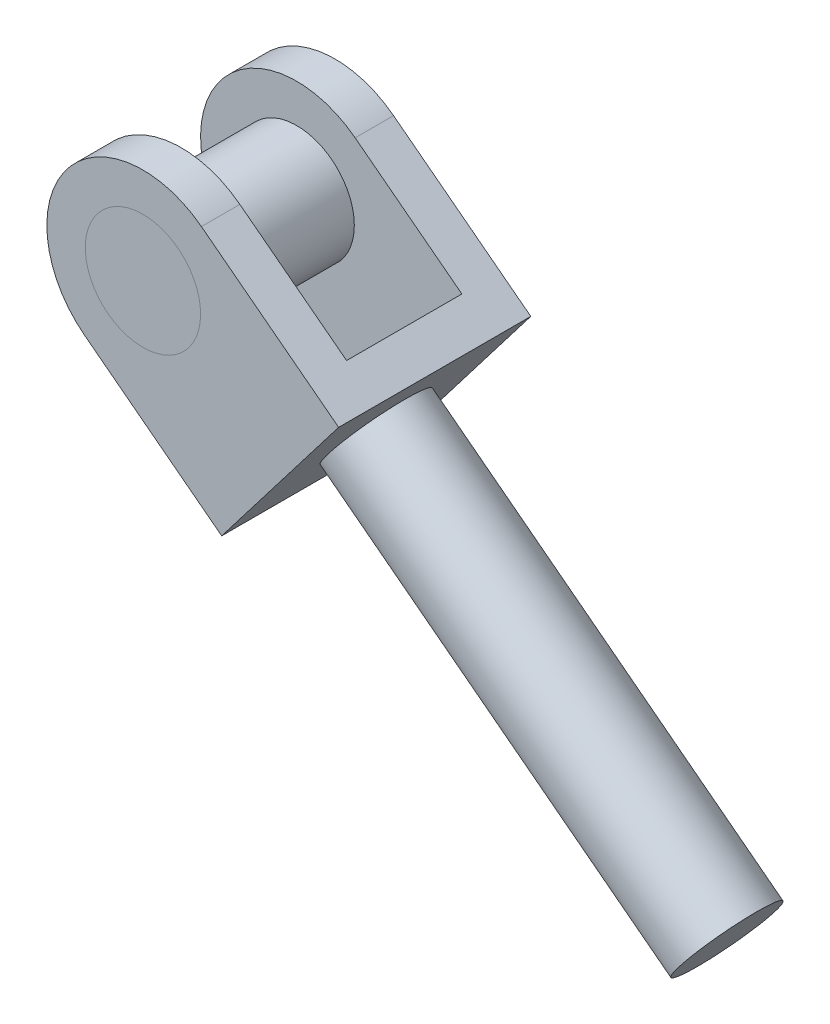
ISO-10303-21;
HEADER;
FILE_DESCRIPTION(('STEP AP214'),'2;1');
FILE_NAME('part.step','',(''),(''),'','','');
FILE_SCHEMA(('AUTOMOTIVE_DESIGN { 1 0 10303 214 1 1 1 1 }'));
ENDSEC;
DATA;
#1=APPLICATION_CONTEXT('core data for automotive mechanical design processes');
#2=APPLICATION_PROTOCOL_DEFINITION('international standard','automotive_design',2000,#1);
#3=PRODUCT_CONTEXT('',#1,'mechanical');
#4=PRODUCT('Part','Part','',(#3));
#5=PRODUCT_RELATED_PRODUCT_CATEGORY('part','',(#4));
#6=PRODUCT_DEFINITION_FORMATION('','',#4);
#7=PRODUCT_DEFINITION_CONTEXT('part definition',#1,'design');
#8=PRODUCT_DEFINITION('design','',#6,#7);
#9=PRODUCT_DEFINITION_SHAPE('','',#8);
#10=(LENGTH_UNIT() NAMED_UNIT(*) SI_UNIT(.MILLI.,.METRE.));
#11=(NAMED_UNIT(*) PLANE_ANGLE_UNIT() SI_UNIT($,.RADIAN.));
#12=(NAMED_UNIT(*) SI_UNIT($,.STERADIAN.) SOLID_ANGLE_UNIT());
#13=UNCERTAINTY_MEASURE_WITH_UNIT(LENGTH_MEASURE(1.E-05),#10,'distance_accuracy_value','');
#14=(GEOMETRIC_REPRESENTATION_CONTEXT(3) GLOBAL_UNCERTAINTY_ASSIGNED_CONTEXT((#13)) GLOBAL_UNIT_ASSIGNED_CONTEXT((#10,
#11,#12)) REPRESENTATION_CONTEXT('',''));
#15=CARTESIAN_POINT('',(0.,0.,0.));
#16=DIRECTION('',(0.,0.,1.));
#17=DIRECTION('',(1.,0.,0.));
#18=AXIS2_PLACEMENT_3D('',#15,#16,#17);
#19=CARTESIAN_POINT('',(-30.,45.,-13.4852813742386));
#20=DIRECTION('',(0.,0.,1.));
#21=DIRECTION('',(1.,0.,0.));
#22=AXIS2_PLACEMENT_3D('',#19,#20,#21);
#23=CYLINDRICAL_SURFACE('',#22,3.);
#24=CARTESIAN_POINT('',(-30.,45.,-5.));
#25=DIRECTION('',(0.,0.,1.));
#26=DIRECTION('',(0.,-1.,0.));
#27=AXIS2_PLACEMENT_3D('',#24,#25,#26);
#28=CIRCLE('',#27,3.);
#29=CARTESIAN_POINT('',(-30.,42.,-5.));
#30=VERTEX_POINT('',#29);
#31=EDGE_CURVE('P0_E10',#30,#30,#28,.F.);
#32=ORIENTED_EDGE('',*,*,#31,.F.);
#33=EDGE_LOOP('',(#32));
#34=FACE_BOUND('',#33,.T.);
#35=CARTESIAN_POINT('',(-30.,45.,5.));
#36=DIRECTION('',(0.,0.,1.));
#37=DIRECTION('',(1.,0.,0.));
#38=AXIS2_PLACEMENT_3D('',#35,#36,#37);
#39=CIRCLE('',#38,3.);
#40=CARTESIAN_POINT('',(-27.,45.,5.));
#41=VERTEX_POINT('',#40);
#42=EDGE_CURVE('P0_E21',#41,#41,#39,.T.);
#43=ORIENTED_EDGE('',*,*,#42,.F.);
#44=EDGE_LOOP('',(#43));
#45=FACE_BOUND('',#44,.T.);
#46=ADVANCED_FACE('P0_F15',(#34,#45),#23,.T.);
#47=CARTESIAN_POINT('',(-30.,45.,5.));
#48=DIRECTION('',(0.,0.,1.));
#49=DIRECTION('',(1.,0.,0.));
#50=AXIS2_PLACEMENT_3D('',#47,#48,#49);
#51=PLANE('',#50);
#52=ORIENTED_EDGE('',*,*,#42,.T.);
#53=EDGE_LOOP('',(#52));
#54=FACE_BOUND('',#53,.T.);
#55=ADVANCED_FACE('P0_F27',(#54),#51,.T.);
#56=CARTESIAN_POINT('',(-19.8156699022371,43.4902250300793,-5.));
#57=DIRECTION('',(0.,0.,1.));
#58=DIRECTION('',(0.,-1.,0.));
#59=AXIS2_PLACEMENT_3D('',#56,#57,#58);
#60=PLANE('',#59);
#61=ORIENTED_EDGE('',*,*,#31,.T.);
#62=EDGE_LOOP('',(#61));
#63=FACE_BOUND('',#62,.T.);
#64=ADVANCED_FACE('P0_F35',(#63),#60,.F.);
#65=CLOSED_SHELL('',(#46,#55,#64));
#66=MANIFOLD_SOLID_BREP('P0_B1',#65);
#67=CARTESIAN_POINT('',(-35.0651068984367,26.8937619978095,0.));
#68=DIRECTION('',(0.793491471983616,-0.608581369982088,0.));
#69=DIRECTION('',(0.608581369982088,0.793491471983616,0.));
#70=AXIS2_PLACEMENT_3D('',#67,#68,#69);
#71=PLANE('',#70);
#72=DIRECTION('',(0.608581369982088,0.793491471983616,0.));
#73=VECTOR('',#72,1.);
#74=CARTESIAN_POINT('',(-27.4884665460251,36.7724730502073,-3.));
#75=LINE('',#74,#73);
#76=CARTESIAN_POINT('',(-27.4884665460251,36.7724730502073,-3.));
#77=VERTEX_POINT('',#76);
#78=CARTESIAN_POINT('',(-21.4026528462043,44.7073877700434,-3.));
#79=VERTEX_POINT('',#78);
#80=EDGE_CURVE('P1_E126',#77,#79,#75,.T.);
#81=ORIENTED_EDGE('',*,*,#80,.F.);
#82=DIRECTION('',(0.,0.,-1.));
#83=VECTOR('',#82,1.);
#84=CARTESIAN_POINT('',(-27.4884665460251,36.7724730502073,5.));
#85=LINE('',#84,#83);
#86=CARTESIAN_POINT('',(-27.4884665460251,36.7724730502073,3.));
#87=VERTEX_POINT('',#86);
#88=EDGE_CURVE('P1_E98',#87,#77,#85,.T.);
#89=ORIENTED_EDGE('',*,*,#88,.F.);
#90=DIRECTION('',(0.608581369982088,0.793491471983616,0.));
#91=VECTOR('',#90,1.);
#92=CARTESIAN_POINT('',(-27.4884665460251,36.7724730502073,3.));
#93=LINE('',#92,#91);
#94=CARTESIAN_POINT('',(-21.4026528462043,44.7073877700434,3.));
#95=VERTEX_POINT('',#94);
#96=EDGE_CURVE('P1_E73',#87,#95,#93,.T.);
#97=ORIENTED_EDGE('',*,*,#96,.T.);
#98=DIRECTION('',(0.,0.,1.));
#99=VECTOR('',#98,1.);
#100=CARTESIAN_POINT('',(-21.4026528462043,44.7073877700435,5.));
#101=LINE('',#100,#99);
#102=EDGE_CURVE('P1_E95',#79,#95,#101,.T.);
#103=ORIENTED_EDGE('',*,*,#102,.F.);
#104=EDGE_LOOP('',(#81,#89,#97,#103));
#105=FACE_BOUND('',#104,.T.);
#106=ADVANCED_FACE('P1_F17',(#105),#71,.F.);
#107=CARTESIAN_POINT('',(-30.,45.,5.));
#108=DIRECTION('',(0.,0.,1.));
#109=DIRECTION('',(1.,0.,0.));
#110=AXIS2_PLACEMENT_3D('',#107,#108,#109);
#111=PLANE('',#110);
#112=DIRECTION('',(0.793491471983616,-0.608581369982088,0.));
#113=VECTOR('',#112,1.);
#114=CARTESIAN_POINT('',(-33.0429068499105,41.0325426400819,5.));
#115=LINE('',#114,#113);
#116=CARTESIAN_POINT('',(-33.0429068499105,41.0325426400819,5.));
#117=VERTEX_POINT('',#116);
#118=CARTESIAN_POINT('',(-25.9014836020579,35.5553103102431,5.));
#119=VERTEX_POINT('',#118);
#120=EDGE_CURVE('P1_E68',#117,#119,#115,.T.);
#121=ORIENTED_EDGE('',*,*,#120,.T.);
#122=DIRECTION('',(-0.608581369982088,-0.793491471983616,0.));
#123=VECTOR('',#122,1.);
#124=CARTESIAN_POINT('',(-19.8156699022371,43.4902250300793,5.));
#125=LINE('',#124,#123);
#126=CARTESIAN_POINT('',(-19.8156699022371,43.4902250300793,5.));
#127=VERTEX_POINT('',#126);
#128=EDGE_CURVE('P1_E97',#127,#119,#125,.T.);
#129=ORIENTED_EDGE('',*,*,#128,.F.);
#130=DIRECTION('',(-0.793491471983616,0.608581369982088,0.));
#131=VECTOR('',#130,1.);
#132=CARTESIAN_POINT('',(-21.4026528462043,44.7073877700434,5.));
#133=LINE('',#132,#131);
#134=CARTESIAN_POINT('',(-26.9570931500895,48.9674573599181,5.));
#135=VERTEX_POINT('',#134);
#136=EDGE_CURVE('P1_E74',#127,#135,#133,.T.);
#137=ORIENTED_EDGE('',*,*,#136,.T.);
#138=CARTESIAN_POINT('',(-30.,45.,5.));
#139=DIRECTION('',(0.,0.,1.));
#140=DIRECTION('',(1.,0.,0.));
#141=AXIS2_PLACEMENT_3D('',#138,#139,#140);
#142=CIRCLE('',#141,5.);
#143=EDGE_CURVE('P1_E35',#135,#117,#142,.T.);
#144=ORIENTED_EDGE('',*,*,#143,.T.);
#145=EDGE_LOOP('',(#121,#129,#137,#144));
#146=FACE_BOUND('',#145,.T.);
#147=CARTESIAN_POINT('',(-30.,45.,5.));
#148=DIRECTION('',(0.,0.,1.));
#149=DIRECTION('',(1.,0.,0.));
#150=AXIS2_PLACEMENT_3D('',#147,#148,#149);
#151=CIRCLE('',#150,3.);
#152=CARTESIAN_POINT('',(-27.,45.,5.));
#153=VERTEX_POINT('',#152);
#154=EDGE_CURVE('P1_E80',#153,#153,#151,.T.);
#155=ORIENTED_EDGE('',*,*,#154,.F.);
#156=EDGE_LOOP('',(#155));
#157=FACE_BOUND('',#156,.T.);
#158=ADVANCED_FACE('P1_F164',(#146,#157),#111,.T.);
#159=CARTESIAN_POINT('',(-30.,45.,3.));
#160=DIRECTION('',(0.,0.,1.));
#161=DIRECTION('',(1.,0.,0.));
#162=AXIS2_PLACEMENT_3D('',#159,#160,#161);
#163=PLANE('',#162);
#164=ORIENTED_EDGE('',*,*,#96,.F.);
#165=DIRECTION('',(0.793491471983616,-0.608581369982088,0.));
#166=VECTOR('',#165,1.);
#167=CARTESIAN_POINT('',(-33.0429068499105,41.0325426400819,3.));
#168=LINE('',#167,#166);
#169=CARTESIAN_POINT('',(-33.0429068499105,41.0325426400819,3.));
#170=VERTEX_POINT('',#169);
#171=EDGE_CURVE('P1_E60',#170,#87,#168,.T.);
#172=ORIENTED_EDGE('',*,*,#171,.F.);
#173=CARTESIAN_POINT('',(-30.,45.,3.));
#174=DIRECTION('',(0.,0.,1.));
#175=DIRECTION('',(1.,0.,0.));
#176=AXIS2_PLACEMENT_3D('',#173,#174,#175);
#177=CIRCLE('',#176,5.);
#178=CARTESIAN_POINT('',(-26.9570931500895,48.9674573599181,3.));
#179=VERTEX_POINT('',#178);
#180=EDGE_CURVE('P1_E53',#179,#170,#177,.T.);
#181=ORIENTED_EDGE('',*,*,#180,.F.);
#182=DIRECTION('',(-0.793491471983616,0.608581369982088,0.));
#183=VECTOR('',#182,1.);
#184=CARTESIAN_POINT('',(-21.4026528462043,44.7073877700434,3.));
#185=LINE('',#184,#183);
#186=EDGE_CURVE('P1_E48',#95,#179,#185,.T.);
#187=ORIENTED_EDGE('',*,*,#186,.F.);
#188=EDGE_LOOP('',(#164,#172,#181,#187));
#189=FACE_BOUND('',#188,.T.);
#190=CARTESIAN_POINT('',(-30.,45.,3.));
#191=DIRECTION('',(0.,0.,1.));
#192=DIRECTION('',(1.,0.,0.));
#193=AXIS2_PLACEMENT_3D('',#190,#191,#192);
#194=CIRCLE('',#193,3.);
#195=CARTESIAN_POINT('',(-27.,45.,3.));
#196=VERTEX_POINT('',#195);
#197=EDGE_CURVE('P1_E83',#196,#196,#194,.T.);
#198=ORIENTED_EDGE('',*,*,#197,.T.);
#199=EDGE_LOOP('',(#198));
#200=FACE_BOUND('',#199,.T.);
#201=ADVANCED_FACE('P1_F70',(#189,#200),#163,.F.);
#202=CARTESIAN_POINT('',(-21.4026528462043,44.7073877700434,5.));
#203=DIRECTION('',(-0.608581369982088,-0.793491471983616,0.));
#204=DIRECTION('',(0.793491471983616,-0.608581369982088,0.));
#205=AXIS2_PLACEMENT_3D('',#202,#203,#204);
#206=PLANE('',#205);
#207=ORIENTED_EDGE('',*,*,#186,.T.);
#208=DIRECTION('',(0.,0.,-1.));
#209=VECTOR('',#208,1.);
#210=CARTESIAN_POINT('',(-26.9570931500895,48.9674573599181,5.));
#211=LINE('',#210,#209);
#212=EDGE_CURVE('P1_E21',#135,#179,#211,.T.);
#213=ORIENTED_EDGE('',*,*,#212,.F.);
#214=ORIENTED_EDGE('',*,*,#136,.F.);
#215=DIRECTION('',(0.,0.,1.));
#216=VECTOR('',#215,1.);
#217=CARTESIAN_POINT('',(-19.8156699022371,43.4902250300793,5.));
#218=LINE('',#217,#216);
#219=CARTESIAN_POINT('',(-19.8156699022371,43.4902250300793,-5.));
#220=VERTEX_POINT('',#219);
#221=EDGE_CURVE('P1_E94',#220,#127,#218,.T.);
#222=ORIENTED_EDGE('',*,*,#221,.F.);
#223=DIRECTION('',(-0.793491471983616,0.608581369982088,0.));
#224=VECTOR('',#223,1.);
#225=CARTESIAN_POINT('',(-19.8156699022371,43.4902250300793,-5.));
#226=LINE('',#225,#224);
#227=CARTESIAN_POINT('',(-26.9570931500895,48.9674573599181,-5.));
#228=VERTEX_POINT('',#227);
#229=EDGE_CURVE('P1_E91',#220,#228,#226,.T.);
#230=ORIENTED_EDGE('',*,*,#229,.T.);
#231=DIRECTION('',(0.,0.,1.));
#232=VECTOR('',#231,1.);
#233=CARTESIAN_POINT('',(-26.9570931500895,48.9674573599181,-5.));
#234=LINE('',#233,#232);
#235=CARTESIAN_POINT('',(-26.9570931500895,48.9674573599181,-3.));
#236=VERTEX_POINT('',#235);
#237=EDGE_CURVE('P1_E100',#228,#236,#234,.T.);
#238=ORIENTED_EDGE('',*,*,#237,.T.);
#239=DIRECTION('',(-0.793491471983616,0.608581369982088,0.));
#240=VECTOR('',#239,1.);
#241=CARTESIAN_POINT('',(-21.4026528462043,44.7073877700434,-3.));
#242=LINE('',#241,#240);
#243=EDGE_CURVE('P1_E123',#79,#236,#242,.T.);
#244=ORIENTED_EDGE('',*,*,#243,.F.);
#245=ORIENTED_EDGE('',*,*,#102,.T.);
#246=EDGE_LOOP('',(#207,#213,#214,#222,#230,#238,#244,#245));
#247=FACE_BOUND('',#246,.T.);
#248=ADVANCED_FACE('P1_F19',(#247),#206,.F.);
#249=CARTESIAN_POINT('',(-30.,45.,5.));
#250=DIRECTION('',(0.,0.,-1.));
#251=DIRECTION('',(-1.,0.,0.));
#252=AXIS2_PLACEMENT_3D('',#249,#250,#251);
#253=CYLINDRICAL_SURFACE('',#252,5.);
#254=ORIENTED_EDGE('',*,*,#180,.T.);
#255=DIRECTION('',(0.,0.,-1.));
#256=VECTOR('',#255,1.);
#257=CARTESIAN_POINT('',(-33.0429068499105,41.0325426400819,5.));
#258=LINE('',#257,#256);
#259=EDGE_CURVE('P1_E56',#117,#170,#258,.T.);
#260=ORIENTED_EDGE('',*,*,#259,.F.);
#261=ORIENTED_EDGE('',*,*,#143,.F.);
#262=ORIENTED_EDGE('',*,*,#212,.T.);
#263=EDGE_LOOP('',(#254,#260,#261,#262));
#264=FACE_BOUND('',#263,.T.);
#265=ADVANCED_FACE('P1_F55',(#264),#253,.T.);
#266=CARTESIAN_POINT('',(-33.0429068499105,41.0325426400819,5.));
#267=DIRECTION('',(0.608581369982088,0.793491471983616,0.));
#268=DIRECTION('',(-0.793491471983616,0.608581369982088,0.));
#269=AXIS2_PLACEMENT_3D('',#266,#267,#268);
#270=PLANE('',#269);
#271=ORIENTED_EDGE('',*,*,#171,.T.);
#272=ORIENTED_EDGE('',*,*,#88,.T.);
#273=DIRECTION('',(0.793491471983616,-0.608581369982088,0.));
#274=VECTOR('',#273,1.);
#275=CARTESIAN_POINT('',(-33.0429068499105,41.0325426400819,-3.));
#276=LINE('',#275,#274);
#277=CARTESIAN_POINT('',(-33.0429068499105,41.0325426400819,-3.));
#278=VERTEX_POINT('',#277);
#279=EDGE_CURVE('P1_E117',#278,#77,#276,.T.);
#280=ORIENTED_EDGE('',*,*,#279,.F.);
#281=DIRECTION('',(0.,0.,1.));
#282=VECTOR('',#281,1.);
#283=CARTESIAN_POINT('',(-33.0429068499105,41.0325426400819,-5.));
#284=LINE('',#283,#282);
#285=CARTESIAN_POINT('',(-33.0429068499105,41.0325426400819,-5.));
#286=VERTEX_POINT('',#285);
#287=EDGE_CURVE('P1_E113',#286,#278,#284,.T.);
#288=ORIENTED_EDGE('',*,*,#287,.F.);
#289=DIRECTION('',(-0.793491471983616,0.608581369982088,0.));
#290=VECTOR('',#289,1.);
#291=CARTESIAN_POINT('',(-25.9014836020579,35.5553103102431,-5.));
#292=LINE('',#291,#290);
#293=CARTESIAN_POINT('',(-25.9014836020579,35.5553103102431,-5.));
#294=VERTEX_POINT('',#293);
#295=EDGE_CURVE('P1_E86',#294,#286,#292,.T.);
#296=ORIENTED_EDGE('',*,*,#295,.F.);
#297=DIRECTION('',(0.,0.,-1.));
#298=VECTOR('',#297,1.);
#299=CARTESIAN_POINT('',(-25.9014836020579,35.5553103102431,5.));
#300=LINE('',#299,#298);
#301=EDGE_CURVE('P1_E106',#119,#294,#300,.T.);
#302=ORIENTED_EDGE('',*,*,#301,.F.);
#303=ORIENTED_EDGE('',*,*,#120,.F.);
#304=ORIENTED_EDGE('',*,*,#259,.T.);
#305=EDGE_LOOP('',(#271,#272,#280,#288,#296,#302,#303,#304));
#306=FACE_BOUND('',#305,.T.);
#307=ADVANCED_FACE('P1_F64',(#306),#270,.F.);
#308=CARTESIAN_POINT('',(-30.,45.,5.));
#309=DIRECTION('',(0.,0.,-1.));
#310=DIRECTION('',(-1.,0.,0.));
#311=AXIS2_PLACEMENT_3D('',#308,#309,#310);
#312=CYLINDRICAL_SURFACE('',#311,3.);
#313=ORIENTED_EDGE('',*,*,#154,.T.);
#314=EDGE_LOOP('',(#313));
#315=FACE_BOUND('',#314,.T.);
#316=ORIENTED_EDGE('',*,*,#197,.F.);
#317=EDGE_LOOP('',(#316));
#318=FACE_BOUND('',#317,.T.);
#319=ADVANCED_FACE('P1_F210',(#315,#318),#312,.F.);
#320=CARTESIAN_POINT('',(-19.8156699022371,43.4902250300793,-5.));
#321=DIRECTION('',(0.,0.,1.));
#322=DIRECTION('',(0.,-1.,0.));
#323=AXIS2_PLACEMENT_3D('',#320,#321,#322);
#324=PLANE('',#323);
#325=ORIENTED_EDGE('',*,*,#295,.T.);
#326=CARTESIAN_POINT('',(-30.,45.,-5.));
#327=DIRECTION('',(0.,0.,1.));
#328=DIRECTION('',(1.,0.,0.));
#329=AXIS2_PLACEMENT_3D('',#326,#327,#328);
#330=CIRCLE('',#329,5.);
#331=EDGE_CURVE('P1_E116',#228,#286,#330,.T.);
#332=ORIENTED_EDGE('',*,*,#331,.F.);
#333=ORIENTED_EDGE('',*,*,#229,.F.);
#334=DIRECTION('',(0.608581369982088,0.793491471983616,0.));
#335=VECTOR('',#334,1.);
#336=CARTESIAN_POINT('',(-19.8156699022371,43.4902250300793,-5.));
#337=LINE('',#336,#335);
#338=EDGE_CURVE('P1_E103',#294,#220,#337,.T.);
#339=ORIENTED_EDGE('',*,*,#338,.F.);
#340=EDGE_LOOP('',(#325,#332,#333,#339));
#341=FACE_BOUND('',#340,.T.);
#342=CARTESIAN_POINT('',(-30.,45.,-5.));
#343=DIRECTION('',(0.,0.,1.));
#344=DIRECTION('',(1.,0.,0.));
#345=AXIS2_PLACEMENT_3D('',#342,#343,#344);
#346=CIRCLE('',#345,3.);
#347=CARTESIAN_POINT('',(-27.,45.,-5.));
#348=VERTEX_POINT('',#347);
#349=EDGE_CURVE('P1_E129',#348,#348,#346,.T.);
#350=ORIENTED_EDGE('',*,*,#349,.T.);
#351=EDGE_LOOP('',(#350));
#352=FACE_BOUND('',#351,.T.);
#353=ADVANCED_FACE('P1_F154',(#341,#352),#324,.F.);
#354=CARTESIAN_POINT('',(-33.4781239544694,25.6765992578453,0.));
#355=DIRECTION('',(0.793491471983616,-0.608581369982088,0.));
#356=DIRECTION('',(0.608581369982088,0.793491471983616,0.));
#357=AXIS2_PLACEMENT_3D('',#354,#355,#356);
#358=PLANE('',#357);
#359=CARTESIAN_POINT('',(-22.8585767521475,39.5227676701613,0.));
#360=DIRECTION('',(0.793491471983616,-0.608581369982088,0.));
#361=DIRECTION('',(0.608581369982088,0.793491471983616,0.));
#362=AXIS2_PLACEMENT_3D('',#359,#360,#361);
#363=CIRCLE('',#362,2.5);
#364=CARTESIAN_POINT('',(-21.3371233271923,41.5064963501203,0.));
#365=VERTEX_POINT('',#364);
#366=EDGE_CURVE('P1_E11',#365,#365,#363,.T.);
#367=ORIENTED_EDGE('',*,*,#366,.F.);
#368=EDGE_LOOP('',(#367));
#369=FACE_BOUND('',#368,.T.);
#370=ORIENTED_EDGE('',*,*,#128,.T.);
#371=ORIENTED_EDGE('',*,*,#301,.T.);
#372=ORIENTED_EDGE('',*,*,#338,.T.);
#373=ORIENTED_EDGE('',*,*,#221,.T.);
#374=EDGE_LOOP('',(#370,#371,#372,#373));
#375=FACE_BOUND('',#374,.T.);
#376=ADVANCED_FACE('P1_F150',(#369,#375),#358,.T.);
#377=CARTESIAN_POINT('',(-30.,45.,-3.));
#378=DIRECTION('',(0.,0.,-1.));
#379=DIRECTION('',(1.,0.,0.));
#380=AXIS2_PLACEMENT_3D('',#377,#378,#379);
#381=PLANE('',#380);
#382=ORIENTED_EDGE('',*,*,#80,.T.);
#383=ORIENTED_EDGE('',*,*,#243,.T.);
#384=CARTESIAN_POINT('',(-30.,45.,-3.));
#385=DIRECTION('',(0.,0.,1.));
#386=DIRECTION('',(1.,0.,0.));
#387=AXIS2_PLACEMENT_3D('',#384,#385,#386);
#388=CIRCLE('',#387,5.);
#389=EDGE_CURVE('P1_E120',#236,#278,#388,.T.);
#390=ORIENTED_EDGE('',*,*,#389,.T.);
#391=ORIENTED_EDGE('',*,*,#279,.T.);
#392=EDGE_LOOP('',(#382,#383,#390,#391));
#393=FACE_BOUND('',#392,.T.);
#394=CARTESIAN_POINT('',(-30.,45.,-3.));
#395=DIRECTION('',(0.,0.,1.));
#396=DIRECTION('',(1.,0.,0.));
#397=AXIS2_PLACEMENT_3D('',#394,#395,#396);
#398=CIRCLE('',#397,3.);
#399=CARTESIAN_POINT('',(-27.,45.,-3.));
#400=VERTEX_POINT('',#399);
#401=EDGE_CURVE('P1_E132',#400,#400,#398,.T.);
#402=ORIENTED_EDGE('',*,*,#401,.F.);
#403=EDGE_LOOP('',(#402));
#404=FACE_BOUND('',#403,.T.);
#405=ADVANCED_FACE('P1_F153',(#393,#404),#381,.F.);
#406=CARTESIAN_POINT('',(-30.,45.,-5.));
#407=DIRECTION('',(0.,0.,1.));
#408=DIRECTION('',(-1.,0.,0.));
#409=AXIS2_PLACEMENT_3D('',#406,#407,#408);
#410=CYLINDRICAL_SURFACE('',#409,5.);
#411=ORIENTED_EDGE('',*,*,#389,.F.);
#412=ORIENTED_EDGE('',*,*,#237,.F.);
#413=ORIENTED_EDGE('',*,*,#331,.T.);
#414=ORIENTED_EDGE('',*,*,#287,.T.);
#415=EDGE_LOOP('',(#411,#412,#413,#414));
#416=FACE_BOUND('',#415,.T.);
#417=ADVANCED_FACE('P1_F190',(#416),#410,.T.);
#418=CARTESIAN_POINT('',(-30.,45.,-5.));
#419=DIRECTION('',(0.,0.,1.));
#420=DIRECTION('',(-1.,0.,0.));
#421=AXIS2_PLACEMENT_3D('',#418,#419,#420);
#422=CYLINDRICAL_SURFACE('',#421,3.);
#423=ORIENTED_EDGE('',*,*,#349,.F.);
#424=EDGE_LOOP('',(#423));
#425=FACE_BOUND('',#424,.T.);
#426=ORIENTED_EDGE('',*,*,#401,.T.);
#427=EDGE_LOOP('',(#426));
#428=FACE_BOUND('',#427,.T.);
#429=ADVANCED_FACE('P1_F146',(#425,#428),#422,.F.);
#430=CARTESIAN_POINT('',(-4.60827289652433,25.5253961605732,0.));
#431=DIRECTION('',(-0.793491471983616,0.608581369982088,0.));
#432=DIRECTION('',(-0.608581369982088,-0.793491471983616,0.));
#433=AXIS2_PLACEMENT_3D('',#430,#431,#432);
#434=CYLINDRICAL_SURFACE('',#433,2.5);
#435=CARTESIAN_POINT('',(-4.60827289652433,25.5253961605732,0.));
#436=DIRECTION('',(0.793491471983616,-0.608581369982088,0.));
#437=DIRECTION('',(0.608581369982088,0.793491471983616,0.));
#438=AXIS2_PLACEMENT_3D('',#435,#436,#437);
#439=CIRCLE('',#438,2.5);
#440=CARTESIAN_POINT('',(-3.08681947156911,27.5091248405322,0.));
#441=VERTEX_POINT('',#440);
#442=EDGE_CURVE('P1_E135',#441,#441,#439,.T.);
#443=ORIENTED_EDGE('',*,*,#442,.F.);
#444=EDGE_LOOP('',(#443));
#445=FACE_BOUND('',#444,.T.);
#446=ORIENTED_EDGE('',*,*,#366,.T.);
#447=EDGE_LOOP('',(#446));
#448=FACE_BOUND('',#447,.T.);
#449=ADVANCED_FACE('P1_F143',(#445,#448),#434,.T.);
#450=CARTESIAN_POINT('',(-4.60827289652433,25.5253961605732,0.));
#451=DIRECTION('',(0.793491471983616,-0.608581369982088,0.));
#452=DIRECTION('',(0.608581369982088,0.793491471983616,0.));
#453=AXIS2_PLACEMENT_3D('',#450,#451,#452);
#454=PLANE('',#453);
#455=ORIENTED_EDGE('',*,*,#442,.T.);
#456=EDGE_LOOP('',(#455));
#457=FACE_BOUND('',#456,.T.);
#458=ADVANCED_FACE('P1_F141',(#457),#454,.T.);
#459=CLOSED_SHELL('',(#106,#158,#201,#248,#265,#307,#319,#353,#376,#405,#417,#429,#449,#458));
#460=MANIFOLD_SOLID_BREP('P1_B1',#459);
#461=ADVANCED_BREP_SHAPE_REPRESENTATION('',(#18,#66,#460),#14);
#462=SHAPE_DEFINITION_REPRESENTATION(#9,#461);
ENDSEC;
END-ISO-10303-21;
